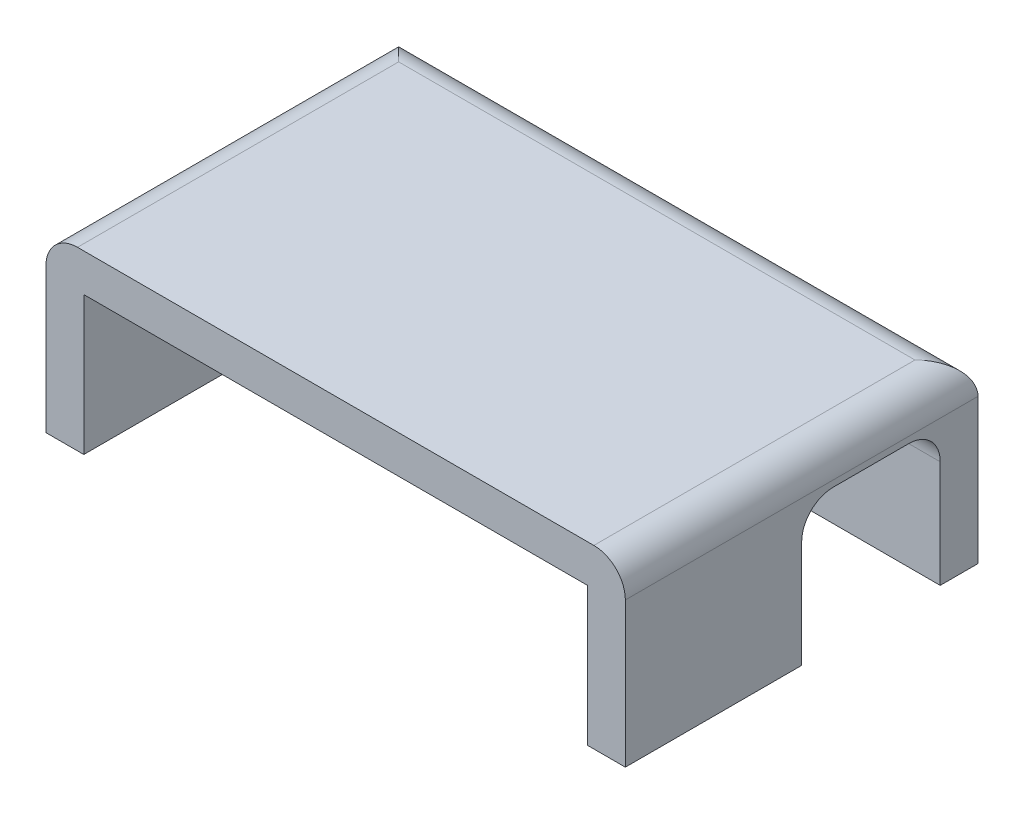
ISO-10303-21;
HEADER;
FILE_DESCRIPTION(('STEP AP214'),'2;1');
FILE_NAME('part.step','',(''),(''),'','','');
FILE_SCHEMA(('AUTOMOTIVE_DESIGN { 1 0 10303 214 1 1 1 1 }'));
ENDSEC;
DATA;
#1=APPLICATION_CONTEXT('core data for automotive mechanical design processes');
#2=APPLICATION_PROTOCOL_DEFINITION('international standard','automotive_design',2000,#1);
#3=PRODUCT_CONTEXT('',#1,'mechanical');
#4=PRODUCT('Part','Part','',(#3));
#5=PRODUCT_RELATED_PRODUCT_CATEGORY('part','',(#4));
#6=PRODUCT_DEFINITION_FORMATION('','',#4);
#7=PRODUCT_DEFINITION_CONTEXT('part definition',#1,'design');
#8=PRODUCT_DEFINITION('design','',#6,#7);
#9=PRODUCT_DEFINITION_SHAPE('','',#8);
#10=(LENGTH_UNIT() NAMED_UNIT(*) SI_UNIT(.MILLI.,.METRE.));
#11=(NAMED_UNIT(*) PLANE_ANGLE_UNIT() SI_UNIT($,.RADIAN.));
#12=(NAMED_UNIT(*) SI_UNIT($,.STERADIAN.) SOLID_ANGLE_UNIT());
#13=UNCERTAINTY_MEASURE_WITH_UNIT(LENGTH_MEASURE(1.E-05),#10,'distance_accuracy_value','');
#14=(GEOMETRIC_REPRESENTATION_CONTEXT(3) GLOBAL_UNCERTAINTY_ASSIGNED_CONTEXT((#13)) GLOBAL_UNIT_ASSIGNED_CONTEXT((#10,
#11,#12)) REPRESENTATION_CONTEXT('',''));
#15=CARTESIAN_POINT('',(0.,0.,0.));
#16=DIRECTION('',(0.,0.,1.));
#17=DIRECTION('',(1.,0.,0.));
#18=AXIS2_PLACEMENT_3D('',#15,#16,#17);
#19=CARTESIAN_POINT('',(0.,0.,0.));
#20=DIRECTION('',(0.,1.,0.));
#21=DIRECTION('',(0.,0.,1.));
#22=AXIS2_PLACEMENT_3D('',#19,#20,#21);
#23=PLANE('',#22);
#24=DIRECTION('',(0.,0.,-1.));
#25=VECTOR('',#24,1.);
#26=CARTESIAN_POINT('',(3.,0.,0.));
#27=LINE('',#26,#25);
#28=CARTESIAN_POINT('',(3.,0.,-25.));
#29=VERTEX_POINT('',#28);
#30=CARTESIAN_POINT('',(3.,0.,-28.));
#31=VERTEX_POINT('',#30);
#32=EDGE_CURVE('E160',#29,#31,#27,.T.);
#33=ORIENTED_EDGE('',*,*,#32,.F.);
#34=DIRECTION('',(1.,0.,0.));
#35=VECTOR('',#34,1.);
#36=CARTESIAN_POINT('',(0.,0.,-25.));
#37=LINE('',#36,#35);
#38=CARTESIAN_POINT('',(-40.,0.,-25.));
#39=VERTEX_POINT('',#38);
#40=EDGE_CURVE('E143',#39,#29,#37,.T.);
#41=ORIENTED_EDGE('',*,*,#40,.F.);
#42=DIRECTION('',(0.,0.,1.));
#43=VECTOR('',#42,1.);
#44=CARTESIAN_POINT('',(-40.,0.,0.));
#45=LINE('',#44,#43);
#46=CARTESIAN_POINT('',(-40.,0.,0.));
#47=VERTEX_POINT('',#46);
#48=EDGE_CURVE('E154',#39,#47,#45,.T.);
#49=ORIENTED_EDGE('',*,*,#48,.T.);
#50=DIRECTION('',(-1.,0.,0.));
#51=VECTOR('',#50,1.);
#52=CARTESIAN_POINT('',(0.,0.,0.));
#53=LINE('',#52,#51);
#54=CARTESIAN_POINT('',(-43.,0.,0.));
#55=VERTEX_POINT('',#54);
#56=EDGE_CURVE('E178',#47,#55,#53,.T.);
#57=ORIENTED_EDGE('',*,*,#56,.T.);
#58=DIRECTION('',(0.,0.,-1.));
#59=VECTOR('',#58,1.);
#60=CARTESIAN_POINT('',(-43.,0.,0.));
#61=LINE('',#60,#59);
#62=CARTESIAN_POINT('',(-43.,0.,-28.));
#63=VERTEX_POINT('',#62);
#64=EDGE_CURVE('E282',#55,#63,#61,.T.);
#65=ORIENTED_EDGE('',*,*,#64,.T.);
#66=DIRECTION('',(-1.,0.,0.));
#67=VECTOR('',#66,1.);
#68=CARTESIAN_POINT('',(0.,0.,-28.));
#69=LINE('',#68,#67);
#70=EDGE_CURVE('E168',#31,#63,#69,.T.);
#71=ORIENTED_EDGE('',*,*,#70,.F.);
#72=EDGE_LOOP('',(#33,#41,#49,#57,#65,#71));
#73=FACE_BOUND('',#72,.T.);
#74=ADVANCED_FACE('F41',(#73),#23,.F.);
#75=CARTESIAN_POINT('',(-40.,14.,0.));
#76=DIRECTION('',(1.,0.,0.));
#77=DIRECTION('',(0.,0.,-1.));
#78=AXIS2_PLACEMENT_3D('',#75,#76,#77);
#79=PLANE('',#78);
#80=DIRECTION('',(0.,-1.,0.));
#81=VECTOR('',#80,1.);
#82=CARTESIAN_POINT('',(-40.,14.,-25.));
#83=LINE('',#82,#81);
#84=CARTESIAN_POINT('',(-40.,8.5,-25.));
#85=VERTEX_POINT('',#84);
#86=EDGE_CURVE('E147',#85,#39,#83,.T.);
#87=ORIENTED_EDGE('',*,*,#86,.F.);
#88=CARTESIAN_POINT('',(-40.,8.5,-22.5));
#89=DIRECTION('',(1.,0.,0.));
#90=DIRECTION('',(0.,0.,-1.));
#91=AXIS2_PLACEMENT_3D('',#88,#89,#90);
#92=CIRCLE('',#91,2.5);
#93=CARTESIAN_POINT('',(-40.,11.,-22.5));
#94=VERTEX_POINT('',#93);
#95=EDGE_CURVE('E243',#85,#94,#92,.T.);
#96=ORIENTED_EDGE('',*,*,#95,.T.);
#97=DIRECTION('',(0.,0.,-1.));
#98=VECTOR('',#97,1.);
#99=CARTESIAN_POINT('',(-40.,11.,40.1123422402632));
#100=LINE('',#99,#98);
#101=CARTESIAN_POINT('',(-40.,11.,0.));
#102=VERTEX_POINT('',#101);
#103=EDGE_CURVE('E296',#102,#94,#100,.T.);
#104=ORIENTED_EDGE('',*,*,#103,.F.);
#105=DIRECTION('',(0.,-1.,0.));
#106=VECTOR('',#105,1.);
#107=CARTESIAN_POINT('',(-40.,14.,0.));
#108=LINE('',#107,#106);
#109=EDGE_CURVE('E199',#102,#47,#108,.T.);
#110=ORIENTED_EDGE('',*,*,#109,.T.);
#111=ORIENTED_EDGE('',*,*,#48,.F.);
#112=EDGE_LOOP('',(#87,#96,#104,#110,#111));
#113=FACE_BOUND('',#112,.T.);
#114=ADVANCED_FACE('F291',(#113),#79,.T.);
#115=CARTESIAN_POINT('',(0.,14.,-25.));
#116=DIRECTION('',(0.,0.,-1.));
#117=DIRECTION('',(-1.,0.,0.));
#118=AXIS2_PLACEMENT_3D('',#115,#116,#117);
#119=PLANE('',#118);
#120=DIRECTION('',(0.,1.,0.));
#121=VECTOR('',#120,1.);
#122=CARTESIAN_POINT('',(3.,0.,-25.));
#123=LINE('',#122,#121);
#124=CARTESIAN_POINT('',(3.,8.5,-25.));
#125=VERTEX_POINT('',#124);
#126=EDGE_CURVE('E146',#29,#125,#123,.T.);
#127=ORIENTED_EDGE('',*,*,#126,.T.);
#128=DIRECTION('',(1.,0.,0.));
#129=VECTOR('',#128,1.);
#130=CARTESIAN_POINT('',(-40.,8.5,-25.));
#131=LINE('',#130,#129);
#132=EDGE_CURVE('E59',#125,#85,#131,.F.);
#133=ORIENTED_EDGE('',*,*,#132,.T.);
#134=ORIENTED_EDGE('',*,*,#86,.T.);
#135=ORIENTED_EDGE('',*,*,#40,.T.);
#136=EDGE_LOOP('',(#127,#133,#134,#135));
#137=FACE_BOUND('',#136,.T.);
#138=ADVANCED_FACE('F145',(#137),#119,.F.);
#139=CARTESIAN_POINT('',(0.,14.,0.));
#140=DIRECTION('',(1.,0.,0.));
#141=DIRECTION('',(0.,0.,-1.));
#142=AXIS2_PLACEMENT_3D('',#139,#140,#141);
#143=PLANE('',#142);
#144=DIRECTION('',(0.,0.,-1.));
#145=VECTOR('',#144,1.);
#146=CARTESIAN_POINT('',(0.,11.,40.1123422402632));
#147=LINE('',#146,#145);
#148=CARTESIAN_POINT('',(0.,11.,0.));
#149=VERTEX_POINT('',#148);
#150=CARTESIAN_POINT('',(0.,11.,-16.5));
#151=VERTEX_POINT('',#150);
#152=EDGE_CURVE('E67',#149,#151,#147,.T.);
#153=ORIENTED_EDGE('',*,*,#152,.T.);
#154=CARTESIAN_POINT('',(0.,8.5,-16.5));
#155=DIRECTION('',(1.,0.,0.));
#156=DIRECTION('',(0.,0.,-1.));
#157=AXIS2_PLACEMENT_3D('',#154,#155,#156);
#158=CIRCLE('',#157,2.5);
#159=CARTESIAN_POINT('',(0.,8.5,-14.));
#160=VERTEX_POINT('',#159);
#161=EDGE_CURVE('E51',#151,#160,#158,.T.);
#162=ORIENTED_EDGE('',*,*,#161,.T.);
#163=DIRECTION('',(0.,-1.,0.));
#164=VECTOR('',#163,1.);
#165=CARTESIAN_POINT('',(0.,14.,-14.));
#166=LINE('',#165,#164);
#167=CARTESIAN_POINT('',(0.,0.,-14.));
#168=VERTEX_POINT('',#167);
#169=EDGE_CURVE('E343',#160,#168,#166,.T.);
#170=ORIENTED_EDGE('',*,*,#169,.T.);
#171=DIRECTION('',(0.,0.,1.));
#172=VECTOR('',#171,1.);
#173=CARTESIAN_POINT('',(0.,0.,0.));
#174=LINE('',#173,#172);
#175=CARTESIAN_POINT('',(0.,0.,0.));
#176=VERTEX_POINT('',#175);
#177=EDGE_CURVE('E153',#168,#176,#174,.T.);
#178=ORIENTED_EDGE('',*,*,#177,.T.);
#179=DIRECTION('',(0.,-1.,0.));
#180=VECTOR('',#179,1.);
#181=CARTESIAN_POINT('',(0.,14.,0.));
#182=LINE('',#181,#180);
#183=EDGE_CURVE('E193',#149,#176,#182,.T.);
#184=ORIENTED_EDGE('',*,*,#183,.F.);
#185=EDGE_LOOP('',(#153,#162,#170,#178,#184));
#186=FACE_BOUND('',#185,.T.);
#187=ADVANCED_FACE('F341',(#186),#143,.F.);
#188=CARTESIAN_POINT('',(-43.,14.,0.));
#189=DIRECTION('',(-1.,0.,0.));
#190=DIRECTION('',(0.,0.,1.));
#191=AXIS2_PLACEMENT_3D('',#188,#189,#190);
#192=PLANE('',#191);
#193=DIRECTION('',(0.,-1.,0.));
#194=VECTOR('',#193,1.);
#195=CARTESIAN_POINT('',(-43.,14.,0.));
#196=LINE('',#195,#194);
#197=CARTESIAN_POINT('',(-43.,11.5,0.));
#198=VERTEX_POINT('',#197);
#199=EDGE_CURVE('E202',#198,#55,#196,.T.);
#200=ORIENTED_EDGE('',*,*,#199,.F.);
#201=DIRECTION('',(0.,0.,-1.));
#202=VECTOR('',#201,1.);
#203=CARTESIAN_POINT('',(-43.,11.5,0.));
#204=LINE('',#203,#202);
#205=CARTESIAN_POINT('',(-43.,11.5,-28.));
#206=VERTEX_POINT('',#205);
#207=EDGE_CURVE('E224',#198,#206,#204,.T.);
#208=ORIENTED_EDGE('',*,*,#207,.T.);
#209=DIRECTION('',(0.,-1.,0.));
#210=VECTOR('',#209,1.);
#211=CARTESIAN_POINT('',(-43.,14.,-28.));
#212=LINE('',#211,#210);
#213=EDGE_CURVE('E184',#206,#63,#212,.T.);
#214=ORIENTED_EDGE('',*,*,#213,.T.);
#215=ORIENTED_EDGE('',*,*,#64,.F.);
#216=EDGE_LOOP('',(#200,#208,#214,#215));
#217=FACE_BOUND('',#216,.T.);
#218=ADVANCED_FACE('F300',(#217),#192,.T.);
#219=CARTESIAN_POINT('',(0.,14.,0.));
#220=DIRECTION('',(0.,0.,1.));
#221=DIRECTION('',(1.,0.,0.));
#222=AXIS2_PLACEMENT_3D('',#219,#220,#221);
#223=PLANE('',#222);
#224=DIRECTION('',(0.,-1.,0.));
#225=VECTOR('',#224,1.);
#226=CARTESIAN_POINT('',(3.,14.,0.));
#227=LINE('',#226,#225);
#228=CARTESIAN_POINT('',(3.,11.5,0.));
#229=VERTEX_POINT('',#228);
#230=CARTESIAN_POINT('',(3.,0.,0.));
#231=VERTEX_POINT('',#230);
#232=EDGE_CURVE('E190',#229,#231,#227,.T.);
#233=ORIENTED_EDGE('',*,*,#232,.F.);
#234=CARTESIAN_POINT('',(0.500000000000003,11.5,0.));
#235=DIRECTION('',(0.,0.,1.));
#236=DIRECTION('',(1.,0.,0.));
#237=AXIS2_PLACEMENT_3D('',#234,#235,#236);
#238=CIRCLE('',#237,2.5);
#239=CARTESIAN_POINT('',(0.500000000000003,14.,0.));
#240=VERTEX_POINT('',#239);
#241=EDGE_CURVE('E221',#229,#240,#238,.T.);
#242=ORIENTED_EDGE('',*,*,#241,.T.);
#243=DIRECTION('',(-1.,0.,0.));
#244=VECTOR('',#243,1.);
#245=CARTESIAN_POINT('',(0.,14.,0.));
#246=LINE('',#245,#244);
#247=CARTESIAN_POINT('',(-40.5,14.,0.));
#248=VERTEX_POINT('',#247);
#249=EDGE_CURVE('E183',#240,#248,#246,.T.);
#250=ORIENTED_EDGE('',*,*,#249,.T.);
#251=CARTESIAN_POINT('',(-40.5,11.5,0.));
#252=DIRECTION('',(0.,0.,1.));
#253=DIRECTION('',(1.,0.,0.));
#254=AXIS2_PLACEMENT_3D('',#251,#252,#253);
#255=CIRCLE('',#254,2.5);
#256=EDGE_CURVE('E218',#248,#198,#255,.T.);
#257=ORIENTED_EDGE('',*,*,#256,.T.);
#258=ORIENTED_EDGE('',*,*,#199,.T.);
#259=ORIENTED_EDGE('',*,*,#56,.F.);
#260=ORIENTED_EDGE('',*,*,#109,.F.);
#261=DIRECTION('',(1.,0.,0.));
#262=VECTOR('',#261,1.);
#263=CARTESIAN_POINT('',(-40.,11.,0.));
#264=LINE('',#263,#262);
#265=EDGE_CURVE('E284',#102,#149,#264,.T.);
#266=ORIENTED_EDGE('',*,*,#265,.T.);
#267=ORIENTED_EDGE('',*,*,#183,.T.);
#268=EDGE_CURVE('E171',#231,#176,#53,.T.);
#269=ORIENTED_EDGE('',*,*,#268,.F.);
#270=EDGE_LOOP('',(#233,#242,#250,#257,#258,#259,#260,#266,#267,#269));
#271=FACE_BOUND('',#270,.T.);
#272=ADVANCED_FACE('F274',(#271),#223,.T.);
#273=CARTESIAN_POINT('',(3.,14.,0.));
#274=DIRECTION('',(-1.,0.,0.));
#275=DIRECTION('',(0.,0.,1.));
#276=AXIS2_PLACEMENT_3D('',#273,#274,#275);
#277=PLANE('',#276);
#278=DIRECTION('',(0.,-1.,0.));
#279=VECTOR('',#278,1.);
#280=CARTESIAN_POINT('',(3.,14.,-28.));
#281=LINE('',#280,#279);
#282=CARTESIAN_POINT('',(3.,11.5,-28.));
#283=VERTEX_POINT('',#282);
#284=EDGE_CURVE('E187',#283,#31,#281,.T.);
#285=ORIENTED_EDGE('',*,*,#284,.F.);
#286=DIRECTION('',(0.,0.,-1.));
#287=VECTOR('',#286,1.);
#288=CARTESIAN_POINT('',(3.,11.5,0.));
#289=LINE('',#288,#287);
#290=EDGE_CURVE('E215',#283,#229,#289,.F.);
#291=ORIENTED_EDGE('',*,*,#290,.T.);
#292=ORIENTED_EDGE('',*,*,#232,.T.);
#293=CARTESIAN_POINT('',(3.,0.,-14.));
#294=VERTEX_POINT('',#293);
#295=EDGE_CURVE('E170',#231,#294,#27,.T.);
#296=ORIENTED_EDGE('',*,*,#295,.T.);
#297=DIRECTION('',(0.,-1.,0.));
#298=VECTOR('',#297,1.);
#299=CARTESIAN_POINT('',(3.,0.,-14.));
#300=LINE('',#299,#298);
#301=CARTESIAN_POINT('',(3.,8.5,-14.));
#302=VERTEX_POINT('',#301);
#303=EDGE_CURVE('E353',#302,#294,#300,.T.);
#304=ORIENTED_EDGE('',*,*,#303,.F.);
#305=CARTESIAN_POINT('',(3.,8.5,-16.5));
#306=DIRECTION('',(-1.,0.,0.));
#307=DIRECTION('',(0.,0.,1.));
#308=AXIS2_PLACEMENT_3D('',#305,#306,#307);
#309=CIRCLE('',#308,2.5);
#310=CARTESIAN_POINT('',(3.,11.,-16.5));
#311=VERTEX_POINT('',#310);
#312=EDGE_CURVE('E246',#302,#311,#309,.T.);
#313=ORIENTED_EDGE('',*,*,#312,.T.);
#314=DIRECTION('',(0.,0.,1.));
#315=VECTOR('',#314,1.);
#316=CARTESIAN_POINT('',(3.,11.,-25.));
#317=LINE('',#316,#315);
#318=CARTESIAN_POINT('',(3.,11.,-22.5));
#319=VERTEX_POINT('',#318);
#320=EDGE_CURVE('E164',#319,#311,#317,.T.);
#321=ORIENTED_EDGE('',*,*,#320,.F.);
#322=CARTESIAN_POINT('',(3.,8.5,-22.5));
#323=DIRECTION('',(-1.,0.,0.));
#324=DIRECTION('',(0.,0.,1.));
#325=AXIS2_PLACEMENT_3D('',#322,#323,#324);
#326=CIRCLE('',#325,2.5);
#327=EDGE_CURVE('E11',#319,#125,#326,.T.);
#328=ORIENTED_EDGE('',*,*,#327,.T.);
#329=ORIENTED_EDGE('',*,*,#126,.F.);
#330=ORIENTED_EDGE('',*,*,#32,.T.);
#331=EDGE_LOOP('',(#285,#291,#292,#296,#304,#313,#321,#328,#329,#330));
#332=FACE_BOUND('',#331,.T.);
#333=ADVANCED_FACE('F159',(#332),#277,.F.);
#334=CARTESIAN_POINT('',(0.,14.,-28.));
#335=DIRECTION('',(0.,0.,1.));
#336=DIRECTION('',(1.,0.,0.));
#337=AXIS2_PLACEMENT_3D('',#334,#335,#336);
#338=PLANE('',#337);
#339=ORIENTED_EDGE('',*,*,#213,.F.);
#340=DIRECTION('',(-1.,0.,0.));
#341=VECTOR('',#340,1.);
#342=CARTESIAN_POINT('',(3.,11.5,-28.));
#343=LINE('',#342,#341);
#344=EDGE_CURVE('E227',#206,#283,#343,.F.);
#345=ORIENTED_EDGE('',*,*,#344,.T.);
#346=ORIENTED_EDGE('',*,*,#284,.T.);
#347=ORIENTED_EDGE('',*,*,#70,.T.);
#348=EDGE_LOOP('',(#339,#345,#346,#347));
#349=FACE_BOUND('',#348,.T.);
#350=ADVANCED_FACE('F303',(#349),#338,.F.);
#351=CARTESIAN_POINT('',(0.,14.,0.));
#352=DIRECTION('',(0.,1.,0.));
#353=DIRECTION('',(0.,0.,1.));
#354=AXIS2_PLACEMENT_3D('',#351,#352,#353);
#355=PLANE('',#354);
#356=ORIENTED_EDGE('',*,*,#249,.F.);
#357=DIRECTION('',(0.,0.,-1.));
#358=VECTOR('',#357,1.);
#359=CARTESIAN_POINT('',(0.500000000000003,14.,-28.));
#360=LINE('',#359,#358);
#361=CARTESIAN_POINT('',(0.500000000000003,14.,-25.5));
#362=VERTEX_POINT('',#361);
#363=EDGE_CURVE('E211',#240,#362,#360,.T.);
#364=ORIENTED_EDGE('',*,*,#363,.T.);
#365=DIRECTION('',(-1.,0.,0.));
#366=VECTOR('',#365,1.);
#367=CARTESIAN_POINT('',(-43.,14.,-25.5));
#368=LINE('',#367,#366);
#369=CARTESIAN_POINT('',(-40.5,14.,-25.5));
#370=VERTEX_POINT('',#369);
#371=EDGE_CURVE('E205',#362,#370,#368,.T.);
#372=ORIENTED_EDGE('',*,*,#371,.T.);
#373=DIRECTION('',(0.,0.,-1.));
#374=VECTOR('',#373,1.);
#375=CARTESIAN_POINT('',(-40.5,14.,0.));
#376=LINE('',#375,#374);
#377=EDGE_CURVE('E208',#370,#248,#376,.F.);
#378=ORIENTED_EDGE('',*,*,#377,.T.);
#379=EDGE_LOOP('',(#356,#364,#372,#378));
#380=FACE_BOUND('',#379,.T.);
#381=ADVANCED_FACE('F271',(#380),#355,.T.);
#382=ORIENTED_EDGE('',*,*,#177,.F.);
#383=DIRECTION('',(1.,0.,0.));
#384=VECTOR('',#383,1.);
#385=CARTESIAN_POINT('',(-9.,0.,-14.));
#386=LINE('',#385,#384);
#387=EDGE_CURVE('E338',#168,#294,#386,.T.);
#388=ORIENTED_EDGE('',*,*,#387,.T.);
#389=ORIENTED_EDGE('',*,*,#295,.F.);
#390=ORIENTED_EDGE('',*,*,#268,.T.);
#391=EDGE_LOOP('',(#382,#388,#389,#390));
#392=FACE_BOUND('',#391,.T.);
#393=ADVANCED_FACE('F317',(#392),#23,.F.);
#394=CARTESIAN_POINT('',(-40.,11.,40.1123422402632));
#395=DIRECTION('',(0.,1.,0.));
#396=DIRECTION('',(0.,0.,1.));
#397=AXIS2_PLACEMENT_3D('',#394,#395,#396);
#398=PLANE('',#397);
#399=ORIENTED_EDGE('',*,*,#320,.T.);
#400=DIRECTION('',(1.,0.,0.));
#401=VECTOR('',#400,1.);
#402=CARTESIAN_POINT('',(0.,11.,-16.5));
#403=LINE('',#402,#401);
#404=EDGE_CURVE('E238',#311,#151,#403,.F.);
#405=ORIENTED_EDGE('',*,*,#404,.T.);
#406=ORIENTED_EDGE('',*,*,#152,.F.);
#407=ORIENTED_EDGE('',*,*,#265,.F.);
#408=ORIENTED_EDGE('',*,*,#103,.T.);
#409=DIRECTION('',(1.,0.,0.));
#410=VECTOR('',#409,1.);
#411=CARTESIAN_POINT('',(3.,11.,-22.5));
#412=LINE('',#411,#410);
#413=EDGE_CURVE('E234',#94,#319,#412,.T.);
#414=ORIENTED_EDGE('',*,*,#413,.T.);
#415=EDGE_LOOP('',(#399,#405,#406,#407,#408,#414));
#416=FACE_BOUND('',#415,.T.);
#417=ADVANCED_FACE('F325',(#416),#398,.F.);
#418=CARTESIAN_POINT('',(-9.,0.,-14.));
#419=DIRECTION('',(0.,0.,1.));
#420=DIRECTION('',(1.,0.,0.));
#421=AXIS2_PLACEMENT_3D('',#418,#419,#420);
#422=PLANE('',#421);
#423=ORIENTED_EDGE('',*,*,#169,.F.);
#424=DIRECTION('',(1.,0.,0.));
#425=VECTOR('',#424,1.);
#426=CARTESIAN_POINT('',(3.,8.5,-14.));
#427=LINE('',#426,#425);
#428=EDGE_CURVE('E230',#160,#302,#427,.T.);
#429=ORIENTED_EDGE('',*,*,#428,.T.);
#430=ORIENTED_EDGE('',*,*,#303,.T.);
#431=ORIENTED_EDGE('',*,*,#387,.F.);
#432=EDGE_LOOP('',(#423,#429,#430,#431));
#433=FACE_BOUND('',#432,.T.);
#434=ADVANCED_FACE('F331',(#433),#422,.F.);
#435=CARTESIAN_POINT('',(-40.5,11.5,0.));
#436=DIRECTION('',(0.,0.,-1.));
#437=DIRECTION('',(-1.,0.,0.));
#438=AXIS2_PLACEMENT_3D('',#435,#436,#437);
#439=CYLINDRICAL_SURFACE('',#438,2.5);
#440=ORIENTED_EDGE('',*,*,#256,.F.);
#441=ORIENTED_EDGE('',*,*,#377,.F.);
#442=CARTESIAN_POINT('',(-40.5,11.5,-25.5));
#443=DIRECTION('',(0.707106781186547,0.,-0.707106781186547));
#444=DIRECTION('',(0.707106781186548,0.,0.707106781186547));
#445=AXIS2_PLACEMENT_3D('',#442,#443,#444);
#446=ELLIPSE('',#445,3.53553390593274,2.5);
#447=EDGE_CURVE('E45',#206,#370,#446,.T.);
#448=ORIENTED_EDGE('',*,*,#447,.F.);
#449=ORIENTED_EDGE('',*,*,#207,.F.);
#450=EDGE_LOOP('',(#440,#441,#448,#449));
#451=FACE_BOUND('',#450,.T.);
#452=ADVANCED_FACE('F267',(#451),#439,.T.);
#453=CARTESIAN_POINT('',(0.,11.5,-25.5));
#454=DIRECTION('',(1.,0.,0.));
#455=DIRECTION('',(0.,0.,-1.));
#456=AXIS2_PLACEMENT_3D('',#453,#454,#455);
#457=CYLINDRICAL_SURFACE('',#456,2.5);
#458=ORIENTED_EDGE('',*,*,#447,.T.);
#459=ORIENTED_EDGE('',*,*,#371,.F.);
#460=CARTESIAN_POINT('',(0.500000000000003,11.5,-25.5));
#461=DIRECTION('',(0.707106781186548,0.,0.707106781186547));
#462=DIRECTION('',(0.707106781186547,0.,-0.707106781186547));
#463=AXIS2_PLACEMENT_3D('',#460,#461,#462);
#464=ELLIPSE('',#463,3.53553390593274,2.5);
#465=EDGE_CURVE('E250',#283,#362,#464,.T.);
#466=ORIENTED_EDGE('',*,*,#465,.F.);
#467=ORIENTED_EDGE('',*,*,#344,.F.);
#468=EDGE_LOOP('',(#458,#459,#466,#467));
#469=FACE_BOUND('',#468,.T.);
#470=ADVANCED_FACE('F262',(#469),#457,.T.);
#471=CARTESIAN_POINT('',(0.500000000000003,11.5,0.));
#472=DIRECTION('',(0.,0.,1.));
#473=DIRECTION('',(1.,0.,0.));
#474=AXIS2_PLACEMENT_3D('',#471,#472,#473);
#475=CYLINDRICAL_SURFACE('',#474,2.5);
#476=ORIENTED_EDGE('',*,*,#241,.F.);
#477=ORIENTED_EDGE('',*,*,#290,.F.);
#478=ORIENTED_EDGE('',*,*,#465,.T.);
#479=ORIENTED_EDGE('',*,*,#363,.F.);
#480=EDGE_LOOP('',(#476,#477,#478,#479));
#481=FACE_BOUND('',#480,.T.);
#482=ADVANCED_FACE('F304',(#481),#475,.T.);
#483=CARTESIAN_POINT('',(-9.,8.5,-16.5));
#484=DIRECTION('',(-1.,0.,0.));
#485=DIRECTION('',(0.,0.,1.));
#486=AXIS2_PLACEMENT_3D('',#483,#484,#485);
#487=CYLINDRICAL_SURFACE('',#486,2.5);
#488=ORIENTED_EDGE('',*,*,#161,.F.);
#489=ORIENTED_EDGE('',*,*,#404,.F.);
#490=ORIENTED_EDGE('',*,*,#312,.F.);
#491=ORIENTED_EDGE('',*,*,#428,.F.);
#492=EDGE_LOOP('',(#488,#489,#490,#491));
#493=FACE_BOUND('',#492,.T.);
#494=ADVANCED_FACE('F306',(#493),#487,.F.);
#495=CARTESIAN_POINT('',(-40.,8.5,-22.5));
#496=DIRECTION('',(-1.,0.,0.));
#497=DIRECTION('',(0.,0.,1.));
#498=AXIS2_PLACEMENT_3D('',#495,#496,#497);
#499=CYLINDRICAL_SURFACE('',#498,2.5);
#500=ORIENTED_EDGE('',*,*,#95,.F.);
#501=ORIENTED_EDGE('',*,*,#132,.F.);
#502=ORIENTED_EDGE('',*,*,#327,.F.);
#503=ORIENTED_EDGE('',*,*,#413,.F.);
#504=EDGE_LOOP('',(#500,#501,#502,#503));
#505=FACE_BOUND('',#504,.T.);
#506=ADVANCED_FACE('F43',(#505),#499,.F.);
#507=CLOSED_SHELL('',(#74,#114,#138,#187,#218,#272,#333,#350,#381,#393,#417,#434,#452,#470,#482,
#494,#506));
#508=MANIFOLD_SOLID_BREP('B2',#507);
#509=ADVANCED_BREP_SHAPE_REPRESENTATION('',(#18,#508),#14);
#510=SHAPE_DEFINITION_REPRESENTATION(#9,#509);
ENDSEC;
END-ISO-10303-21;
